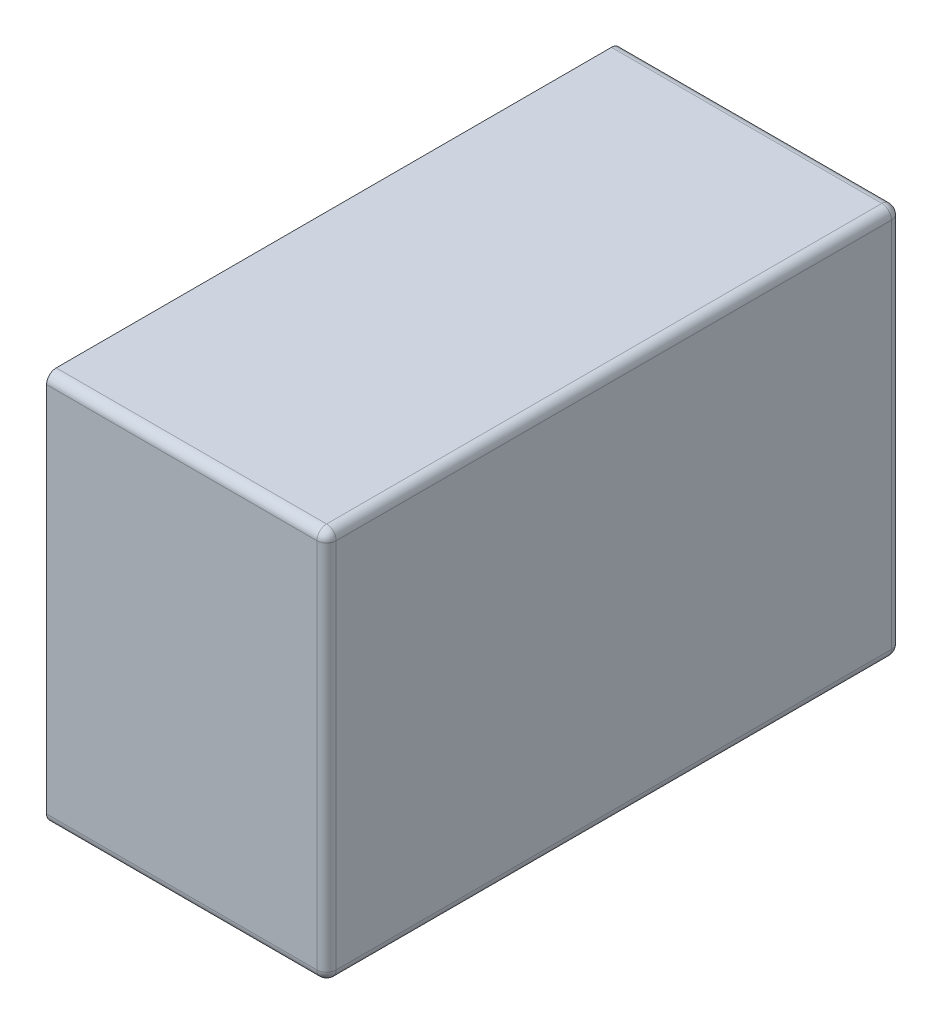
ISO-10303-21;
HEADER;
FILE_DESCRIPTION(('STEP AP214'),'2;1');
FILE_NAME('part.step','',(''),(''),'','','');
FILE_SCHEMA(('AUTOMOTIVE_DESIGN { 1 0 10303 214 1 1 1 1 }'));
ENDSEC;
DATA;
#1=APPLICATION_CONTEXT('core data for automotive mechanical design processes');
#2=APPLICATION_PROTOCOL_DEFINITION('international standard','automotive_design',2000,#1);
#3=PRODUCT_CONTEXT('',#1,'mechanical');
#4=PRODUCT('Part','Part','',(#3));
#5=PRODUCT_RELATED_PRODUCT_CATEGORY('part','',(#4));
#6=PRODUCT_DEFINITION_FORMATION('','',#4);
#7=PRODUCT_DEFINITION_CONTEXT('part definition',#1,'design');
#8=PRODUCT_DEFINITION('design','',#6,#7);
#9=PRODUCT_DEFINITION_SHAPE('','',#8);
#10=(LENGTH_UNIT() NAMED_UNIT(*) SI_UNIT(.MILLI.,.METRE.));
#11=(NAMED_UNIT(*) PLANE_ANGLE_UNIT() SI_UNIT($,.RADIAN.));
#12=(NAMED_UNIT(*) SI_UNIT($,.STERADIAN.) SOLID_ANGLE_UNIT());
#13=UNCERTAINTY_MEASURE_WITH_UNIT(LENGTH_MEASURE(1.E-05),#10,'distance_accuracy_value','');
#14=(GEOMETRIC_REPRESENTATION_CONTEXT(3) GLOBAL_UNCERTAINTY_ASSIGNED_CONTEXT((#13)) GLOBAL_UNIT_ASSIGNED_CONTEXT((#10,
#11,#12)) REPRESENTATION_CONTEXT('',''));
#15=CARTESIAN_POINT('',(0.,0.,0.));
#16=DIRECTION('',(0.,0.,1.));
#17=DIRECTION('',(1.,0.,0.));
#18=AXIS2_PLACEMENT_3D('',#15,#16,#17);
#19=CARTESIAN_POINT('',(145.,405.,-297.5));
#20=DIRECTION('',(-1.,0.,0.));
#21=DIRECTION('',(0.,0.,1.));
#22=AXIS2_PLACEMENT_3D('',#19,#20,#21);
#23=PLANE('',#22);
#24=DIRECTION('',(0.,-1.,0.));
#25=VECTOR('',#24,1.);
#26=CARTESIAN_POINT('',(145.,405.,287.5));
#27=LINE('',#26,#25);
#28=CARTESIAN_POINT('',(145.,395.,287.5));
#29=VERTEX_POINT('',#28);
#30=CARTESIAN_POINT('',(145.,10.,287.5));
#31=VERTEX_POINT('',#30);
#32=EDGE_CURVE('E192',#29,#31,#27,.T.);
#33=ORIENTED_EDGE('',*,*,#32,.T.);
#34=DIRECTION('',(0.,0.,-1.));
#35=VECTOR('',#34,1.);
#36=CARTESIAN_POINT('',(145.,10.,-297.5));
#37=LINE('',#36,#35);
#38=CARTESIAN_POINT('',(145.,10.,-287.5));
#39=VERTEX_POINT('',#38);
#40=EDGE_CURVE('E198',#31,#39,#37,.T.);
#41=ORIENTED_EDGE('',*,*,#40,.T.);
#42=DIRECTION('',(0.,-1.,0.));
#43=VECTOR('',#42,1.);
#44=CARTESIAN_POINT('',(145.,405.,-287.5));
#45=LINE('',#44,#43);
#46=CARTESIAN_POINT('',(145.,395.,-287.5));
#47=VERTEX_POINT('',#46);
#48=EDGE_CURVE('E196',#39,#47,#45,.F.);
#49=ORIENTED_EDGE('',*,*,#48,.T.);
#50=DIRECTION('',(0.,0.,-1.));
#51=VECTOR('',#50,1.);
#52=CARTESIAN_POINT('',(145.,395.,297.5));
#53=LINE('',#52,#51);
#54=EDGE_CURVE('E194',#47,#29,#53,.F.);
#55=ORIENTED_EDGE('',*,*,#54,.T.);
#56=EDGE_LOOP('',(#33,#41,#49,#55));
#57=FACE_BOUND('',#56,.T.);
#58=ADVANCED_FACE('F39',(#57),#23,.F.);
#59=CARTESIAN_POINT('',(-145.,405.,-297.5));
#60=DIRECTION('',(0.,0.,1.));
#61=DIRECTION('',(1.,0.,0.));
#62=AXIS2_PLACEMENT_3D('',#59,#60,#61);
#63=PLANE('',#62);
#64=DIRECTION('',(0.,-1.,0.));
#65=VECTOR('',#64,1.);
#66=CARTESIAN_POINT('',(135.,405.,-297.5));
#67=LINE('',#66,#65);
#68=CARTESIAN_POINT('',(135.,395.,-297.5));
#69=VERTEX_POINT('',#68);
#70=CARTESIAN_POINT('',(135.,10.,-297.5));
#71=VERTEX_POINT('',#70);
#72=EDGE_CURVE('E210',#69,#71,#67,.T.);
#73=ORIENTED_EDGE('',*,*,#72,.T.);
#74=DIRECTION('',(-1.,0.,0.));
#75=VECTOR('',#74,1.);
#76=CARTESIAN_POINT('',(-145.,10.,-297.5));
#77=LINE('',#76,#75);
#78=CARTESIAN_POINT('',(-145.,10.,-297.5));
#79=VERTEX_POINT('',#78);
#80=EDGE_CURVE('E212',#71,#79,#77,.T.);
#81=ORIENTED_EDGE('',*,*,#80,.T.);
#82=DIRECTION('',(0.,-1.,0.));
#83=VECTOR('',#82,1.);
#84=CARTESIAN_POINT('',(-145.,405.,-297.5));
#85=LINE('',#84,#83);
#86=CARTESIAN_POINT('',(-145.,395.,-297.5));
#87=VERTEX_POINT('',#86);
#88=EDGE_CURVE('E189',#87,#79,#85,.T.);
#89=ORIENTED_EDGE('',*,*,#88,.F.);
#90=DIRECTION('',(-1.,0.,0.));
#91=VECTOR('',#90,1.);
#92=CARTESIAN_POINT('',(145.,395.,-297.5));
#93=LINE('',#92,#91);
#94=EDGE_CURVE('E208',#87,#69,#93,.F.);
#95=ORIENTED_EDGE('',*,*,#94,.T.);
#96=EDGE_LOOP('',(#73,#81,#89,#95));
#97=FACE_BOUND('',#96,.T.);
#98=ADVANCED_FACE('F296',(#97),#63,.F.);
#99=CARTESIAN_POINT('',(-145.,405.,-297.5));
#100=DIRECTION('',(1.,0.,0.));
#101=DIRECTION('',(0.,0.,-1.));
#102=AXIS2_PLACEMENT_3D('',#99,#100,#101);
#103=PLANE('',#102);
#104=DIRECTION('',(0.,0.,-1.));
#105=VECTOR('',#104,1.);
#106=CARTESIAN_POINT('',(-145.,395.,-287.5));
#107=LINE('',#106,#105);
#108=CARTESIAN_POINT('',(-145.,395.,287.5));
#109=VERTEX_POINT('',#108);
#110=CARTESIAN_POINT('',(-145.,395.,-287.5));
#111=VERTEX_POINT('',#110);
#112=EDGE_CURVE('E170',#109,#111,#107,.T.);
#113=ORIENTED_EDGE('',*,*,#112,.F.);
#114=DIRECTION('',(0.,1.,0.));
#115=VECTOR('',#114,1.);
#116=CARTESIAN_POINT('',(-145.,395.,287.5));
#117=LINE('',#116,#115);
#118=CARTESIAN_POINT('',(-145.,10.,287.5));
#119=VERTEX_POINT('',#118);
#120=EDGE_CURVE('E56',#119,#109,#117,.T.);
#121=ORIENTED_EDGE('',*,*,#120,.F.);
#122=DIRECTION('',(0.,0.,1.));
#123=VECTOR('',#122,1.);
#124=CARTESIAN_POINT('',(-145.,10.,-287.5));
#125=LINE('',#124,#123);
#126=CARTESIAN_POINT('',(-145.,10.,-287.5));
#127=VERTEX_POINT('',#126);
#128=EDGE_CURVE('E161',#127,#119,#125,.T.);
#129=ORIENTED_EDGE('',*,*,#128,.F.);
#130=DIRECTION('',(0.,-1.,0.));
#131=VECTOR('',#130,1.);
#132=CARTESIAN_POINT('',(-145.,395.,-287.5));
#133=LINE('',#132,#131);
#134=EDGE_CURVE('E164',#111,#127,#133,.T.);
#135=ORIENTED_EDGE('',*,*,#134,.F.);
#136=EDGE_LOOP('',(#113,#121,#129,#135));
#137=FACE_BOUND('',#136,.T.);
#138=DIRECTION('',(0.,-1.,0.));
#139=VECTOR('',#138,1.);
#140=CARTESIAN_POINT('',(-145.,405.,297.5));
#141=LINE('',#140,#139);
#142=CARTESIAN_POINT('',(-145.,395.,297.5));
#143=VERTEX_POINT('',#142);
#144=CARTESIAN_POINT('',(-145.,10.,297.5));
#145=VERTEX_POINT('',#144);
#146=EDGE_CURVE('E183',#143,#145,#141,.T.);
#147=ORIENTED_EDGE('',*,*,#146,.F.);
#148=CARTESIAN_POINT('',(-145.,395.,287.5));
#149=DIRECTION('',(1.,0.,0.));
#150=DIRECTION('',(0.,0.,-1.));
#151=AXIS2_PLACEMENT_3D('',#148,#149,#150);
#152=CIRCLE('',#151,10.);
#153=CARTESIAN_POINT('',(-145.,405.,287.5));
#154=VERTEX_POINT('',#153);
#155=EDGE_CURVE('E11',#143,#154,#152,.F.);
#156=ORIENTED_EDGE('',*,*,#155,.T.);
#157=DIRECTION('',(0.,0.,1.));
#158=VECTOR('',#157,1.);
#159=CARTESIAN_POINT('',(-145.,405.,-297.5));
#160=LINE('',#159,#158);
#161=CARTESIAN_POINT('',(-145.,405.,-287.5));
#162=VERTEX_POINT('',#161);
#163=EDGE_CURVE('E180',#162,#154,#160,.T.);
#164=ORIENTED_EDGE('',*,*,#163,.F.);
#165=CARTESIAN_POINT('',(-145.,395.,-287.5));
#166=DIRECTION('',(1.,0.,0.));
#167=DIRECTION('',(0.,0.,-1.));
#168=AXIS2_PLACEMENT_3D('',#165,#166,#167);
#169=CIRCLE('',#168,10.);
#170=EDGE_CURVE('E225',#162,#87,#169,.F.);
#171=ORIENTED_EDGE('',*,*,#170,.T.);
#172=ORIENTED_EDGE('',*,*,#88,.T.);
#173=CARTESIAN_POINT('',(-145.,10.,-287.5));
#174=DIRECTION('',(1.,0.,0.));
#175=DIRECTION('',(0.,0.,-1.));
#176=AXIS2_PLACEMENT_3D('',#173,#174,#175);
#177=CIRCLE('',#176,10.);
#178=CARTESIAN_POINT('',(-145.,0.,-287.5));
#179=VERTEX_POINT('',#178);
#180=EDGE_CURVE('E227',#79,#179,#177,.F.);
#181=ORIENTED_EDGE('',*,*,#180,.T.);
#182=DIRECTION('',(0.,0.,1.));
#183=VECTOR('',#182,1.);
#184=CARTESIAN_POINT('',(-145.,0.,-297.5));
#185=LINE('',#184,#183);
#186=CARTESIAN_POINT('',(-145.,0.,287.5));
#187=VERTEX_POINT('',#186);
#188=EDGE_CURVE('E184',#179,#187,#185,.T.);
#189=ORIENTED_EDGE('',*,*,#188,.T.);
#190=CARTESIAN_POINT('',(-145.,10.,287.5));
#191=DIRECTION('',(1.,0.,0.));
#192=DIRECTION('',(0.,0.,-1.));
#193=AXIS2_PLACEMENT_3D('',#190,#191,#192);
#194=CIRCLE('',#193,10.);
#195=EDGE_CURVE('E48',#187,#145,#194,.F.);
#196=ORIENTED_EDGE('',*,*,#195,.T.);
#197=EDGE_LOOP('',(#147,#156,#164,#171,#172,#181,#189,#196));
#198=FACE_BOUND('',#197,.T.);
#199=ADVANCED_FACE('F293',(#137,#198),#103,.F.);
#200=CARTESIAN_POINT('',(-145.,405.,297.5));
#201=DIRECTION('',(0.,0.,-1.));
#202=DIRECTION('',(-1.,0.,0.));
#203=AXIS2_PLACEMENT_3D('',#200,#201,#202);
#204=PLANE('',#203);
#205=DIRECTION('',(0.,-1.,0.));
#206=VECTOR('',#205,1.);
#207=CARTESIAN_POINT('',(135.,405.,297.5));
#208=LINE('',#207,#206);
#209=CARTESIAN_POINT('',(135.,10.,297.5));
#210=VERTEX_POINT('',#209);
#211=CARTESIAN_POINT('',(135.,395.,297.5));
#212=VERTEX_POINT('',#211);
#213=EDGE_CURVE('E64',#210,#212,#208,.F.);
#214=ORIENTED_EDGE('',*,*,#213,.T.);
#215=DIRECTION('',(1.,0.,0.));
#216=VECTOR('',#215,1.);
#217=CARTESIAN_POINT('',(-145.,395.,297.5));
#218=LINE('',#217,#216);
#219=EDGE_CURVE('E223',#212,#143,#218,.F.);
#220=ORIENTED_EDGE('',*,*,#219,.T.);
#221=ORIENTED_EDGE('',*,*,#146,.T.);
#222=DIRECTION('',(1.,0.,0.));
#223=VECTOR('',#222,1.);
#224=CARTESIAN_POINT('',(-145.,10.,297.5));
#225=LINE('',#224,#223);
#226=EDGE_CURVE('E220',#145,#210,#225,.T.);
#227=ORIENTED_EDGE('',*,*,#226,.T.);
#228=EDGE_LOOP('',(#214,#220,#221,#227));
#229=FACE_BOUND('',#228,.T.);
#230=ADVANCED_FACE('F320',(#229),#204,.F.);
#231=CARTESIAN_POINT('',(0.,405.,0.));
#232=DIRECTION('',(0.,1.,0.));
#233=DIRECTION('',(0.,0.,1.));
#234=AXIS2_PLACEMENT_3D('',#231,#232,#233);
#235=PLANE('',#234);
#236=ORIENTED_EDGE('',*,*,#163,.T.);
#237=DIRECTION('',(1.,0.,0.));
#238=VECTOR('',#237,1.);
#239=CARTESIAN_POINT('',(145.,405.,287.5));
#240=LINE('',#239,#238);
#241=CARTESIAN_POINT('',(135.,405.,287.5));
#242=VERTEX_POINT('',#241);
#243=EDGE_CURVE('E218',#154,#242,#240,.T.);
#244=ORIENTED_EDGE('',*,*,#243,.T.);
#245=DIRECTION('',(0.,0.,-1.));
#246=VECTOR('',#245,1.);
#247=CARTESIAN_POINT('',(135.,405.,-297.5));
#248=LINE('',#247,#246);
#249=CARTESIAN_POINT('',(135.,405.,-287.5));
#250=VERTEX_POINT('',#249);
#251=EDGE_CURVE('E216',#242,#250,#248,.T.);
#252=ORIENTED_EDGE('',*,*,#251,.T.);
#253=DIRECTION('',(-1.,0.,0.));
#254=VECTOR('',#253,1.);
#255=CARTESIAN_POINT('',(-145.,405.,-287.5));
#256=LINE('',#255,#254);
#257=EDGE_CURVE('E214',#250,#162,#256,.T.);
#258=ORIENTED_EDGE('',*,*,#257,.T.);
#259=EDGE_LOOP('',(#236,#244,#252,#258));
#260=FACE_BOUND('',#259,.T.);
#261=ADVANCED_FACE('F282',(#260),#235,.T.);
#262=CARTESIAN_POINT('',(0.,0.,0.));
#263=DIRECTION('',(0.,1.,0.));
#264=DIRECTION('',(0.,0.,1.));
#265=AXIS2_PLACEMENT_3D('',#262,#263,#264);
#266=PLANE('',#265);
#267=DIRECTION('',(0.,0.,-1.));
#268=VECTOR('',#267,1.);
#269=CARTESIAN_POINT('',(135.,0.,0.));
#270=LINE('',#269,#268);
#271=CARTESIAN_POINT('',(135.,0.,-287.5));
#272=VERTEX_POINT('',#271);
#273=CARTESIAN_POINT('',(135.,0.,287.5));
#274=VERTEX_POINT('',#273);
#275=EDGE_CURVE('E203',#272,#274,#270,.F.);
#276=ORIENTED_EDGE('',*,*,#275,.T.);
#277=DIRECTION('',(1.,0.,0.));
#278=VECTOR('',#277,1.);
#279=CARTESIAN_POINT('',(0.,0.,287.5));
#280=LINE('',#279,#278);
#281=EDGE_CURVE('E206',#274,#187,#280,.F.);
#282=ORIENTED_EDGE('',*,*,#281,.T.);
#283=ORIENTED_EDGE('',*,*,#188,.F.);
#284=DIRECTION('',(-1.,0.,0.));
#285=VECTOR('',#284,1.);
#286=CARTESIAN_POINT('',(0.,0.,-287.5));
#287=LINE('',#286,#285);
#288=EDGE_CURVE('E201',#179,#272,#287,.F.);
#289=ORIENTED_EDGE('',*,*,#288,.T.);
#290=EDGE_LOOP('',(#276,#282,#283,#289));
#291=FACE_BOUND('',#290,.T.);
#292=ADVANCED_FACE('F313',(#291),#266,.F.);
#293=CARTESIAN_POINT('',(0.,395.,287.5));
#294=DIRECTION('',(-1.,0.,0.));
#295=DIRECTION('',(0.,0.,1.));
#296=AXIS2_PLACEMENT_3D('',#293,#294,#295);
#297=CYLINDRICAL_SURFACE('',#296,10.);
#298=ORIENTED_EDGE('',*,*,#155,.F.);
#299=ORIENTED_EDGE('',*,*,#219,.F.);
#300=CARTESIAN_POINT('',(135.,395.,287.5));
#301=DIRECTION('',(1.,0.,0.));
#302=DIRECTION('',(0.,0.,-1.));
#303=AXIS2_PLACEMENT_3D('',#300,#301,#302);
#304=CIRCLE('',#303,10.);
#305=EDGE_CURVE('E43',#242,#212,#304,.T.);
#306=ORIENTED_EDGE('',*,*,#305,.F.);
#307=ORIENTED_EDGE('',*,*,#243,.F.);
#308=EDGE_LOOP('',(#298,#299,#306,#307));
#309=FACE_BOUND('',#308,.T.);
#310=ADVANCED_FACE('F41',(#309),#297,.T.);
#311=CARTESIAN_POINT('',(135.,395.,0.));
#312=DIRECTION('',(0.,0.,1.));
#313=DIRECTION('',(1.,0.,0.));
#314=AXIS2_PLACEMENT_3D('',#311,#312,#313);
#315=CYLINDRICAL_SURFACE('',#314,10.);
#316=CARTESIAN_POINT('',(135.,395.,-287.5));
#317=DIRECTION('',(0.,0.,-1.));
#318=DIRECTION('',(-1.,0.,0.));
#319=AXIS2_PLACEMENT_3D('',#316,#317,#318);
#320=CIRCLE('',#319,10.);
#321=EDGE_CURVE('E254',#250,#47,#320,.T.);
#322=ORIENTED_EDGE('',*,*,#321,.F.);
#323=ORIENTED_EDGE('',*,*,#251,.F.);
#324=CARTESIAN_POINT('',(135.,395.,287.5));
#325=DIRECTION('',(0.,0.,1.));
#326=DIRECTION('',(1.,0.,0.));
#327=AXIS2_PLACEMENT_3D('',#324,#325,#326);
#328=CIRCLE('',#327,10.);
#329=EDGE_CURVE('E256',#29,#242,#328,.T.);
#330=ORIENTED_EDGE('',*,*,#329,.F.);
#331=ORIENTED_EDGE('',*,*,#54,.F.);
#332=EDGE_LOOP('',(#322,#323,#330,#331));
#333=FACE_BOUND('',#332,.T.);
#334=ADVANCED_FACE('F279',(#333),#315,.T.);
#335=CARTESIAN_POINT('',(0.,395.,-287.5));
#336=DIRECTION('',(1.,0.,0.));
#337=DIRECTION('',(0.,0.,-1.));
#338=AXIS2_PLACEMENT_3D('',#335,#336,#337);
#339=CYLINDRICAL_SURFACE('',#338,10.);
#340=ORIENTED_EDGE('',*,*,#170,.F.);
#341=ORIENTED_EDGE('',*,*,#257,.F.);
#342=CARTESIAN_POINT('',(135.,395.,-287.5));
#343=DIRECTION('',(1.,0.,0.));
#344=DIRECTION('',(0.,0.,-1.));
#345=AXIS2_PLACEMENT_3D('',#342,#343,#344);
#346=CIRCLE('',#345,10.);
#347=EDGE_CURVE('E251',#69,#250,#346,.T.);
#348=ORIENTED_EDGE('',*,*,#347,.F.);
#349=ORIENTED_EDGE('',*,*,#94,.F.);
#350=EDGE_LOOP('',(#340,#341,#348,#349));
#351=FACE_BOUND('',#350,.T.);
#352=ADVANCED_FACE('F287',(#351),#339,.T.);
#353=CARTESIAN_POINT('',(135.,395.,287.5));
#354=DIRECTION('',(0.,1.,0.));
#355=DIRECTION('',(0.,0.,1.));
#356=AXIS2_PLACEMENT_3D('',#353,#354,#355);
#357=SPHERICAL_SURFACE('',#356,10.);
#358=ORIENTED_EDGE('',*,*,#329,.T.);
#359=ORIENTED_EDGE('',*,*,#305,.T.);
#360=CARTESIAN_POINT('',(135.,395.,287.5));
#361=DIRECTION('',(0.,1.,0.));
#362=DIRECTION('',(0.,0.,1.));
#363=AXIS2_PLACEMENT_3D('',#360,#361,#362);
#364=CIRCLE('',#363,10.);
#365=EDGE_CURVE('E248',#29,#212,#364,.F.);
#366=ORIENTED_EDGE('',*,*,#365,.F.);
#367=EDGE_LOOP('',(#358,#359,#366));
#368=FACE_BOUND('',#367,.T.);
#369=ADVANCED_FACE('F263',(#368),#357,.T.);
#370=CARTESIAN_POINT('',(135.,395.,-287.5));
#371=DIRECTION('',(0.,1.,0.));
#372=DIRECTION('',(0.,0.,1.));
#373=AXIS2_PLACEMENT_3D('',#370,#371,#372);
#374=SPHERICAL_SURFACE('',#373,10.);
#375=ORIENTED_EDGE('',*,*,#347,.T.);
#376=ORIENTED_EDGE('',*,*,#321,.T.);
#377=CARTESIAN_POINT('',(135.,395.,-287.5));
#378=DIRECTION('',(0.,1.,0.));
#379=DIRECTION('',(0.,0.,1.));
#380=AXIS2_PLACEMENT_3D('',#377,#378,#379);
#381=CIRCLE('',#380,10.);
#382=EDGE_CURVE('E245',#69,#47,#381,.F.);
#383=ORIENTED_EDGE('',*,*,#382,.F.);
#384=EDGE_LOOP('',(#375,#376,#383));
#385=FACE_BOUND('',#384,.T.);
#386=ADVANCED_FACE('F352',(#385),#374,.T.);
#387=CARTESIAN_POINT('',(-145.,10.,287.5));
#388=DIRECTION('',(1.,0.,0.));
#389=DIRECTION('',(0.,0.,-1.));
#390=AXIS2_PLACEMENT_3D('',#387,#388,#389);
#391=CYLINDRICAL_SURFACE('',#390,10.);
#392=ORIENTED_EDGE('',*,*,#195,.F.);
#393=ORIENTED_EDGE('',*,*,#281,.F.);
#394=CARTESIAN_POINT('',(135.,10.,287.5));
#395=DIRECTION('',(1.,0.,0.));
#396=DIRECTION('',(0.,0.,-1.));
#397=AXIS2_PLACEMENT_3D('',#394,#395,#396);
#398=CIRCLE('',#397,10.);
#399=EDGE_CURVE('E242',#210,#274,#398,.T.);
#400=ORIENTED_EDGE('',*,*,#399,.F.);
#401=ORIENTED_EDGE('',*,*,#226,.F.);
#402=EDGE_LOOP('',(#392,#393,#400,#401));
#403=FACE_BOUND('',#402,.T.);
#404=ADVANCED_FACE('F319',(#403),#391,.T.);
#405=CARTESIAN_POINT('',(135.,405.,287.5));
#406=DIRECTION('',(0.,-1.,0.));
#407=DIRECTION('',(0.,0.,-1.));
#408=AXIS2_PLACEMENT_3D('',#405,#406,#407);
#409=CYLINDRICAL_SURFACE('',#408,10.);
#410=ORIENTED_EDGE('',*,*,#365,.T.);
#411=ORIENTED_EDGE('',*,*,#213,.F.);
#412=CARTESIAN_POINT('',(135.,10.,287.5));
#413=DIRECTION('',(0.,-1.,0.));
#414=DIRECTION('',(0.,0.,-1.));
#415=AXIS2_PLACEMENT_3D('',#412,#413,#414);
#416=CIRCLE('',#415,10.);
#417=EDGE_CURVE('E239',#31,#210,#416,.T.);
#418=ORIENTED_EDGE('',*,*,#417,.F.);
#419=ORIENTED_EDGE('',*,*,#32,.F.);
#420=EDGE_LOOP('',(#410,#411,#418,#419));
#421=FACE_BOUND('',#420,.T.);
#422=ADVANCED_FACE('F268',(#421),#409,.T.);
#423=CARTESIAN_POINT('',(135.,405.,-287.5));
#424=DIRECTION('',(0.,-1.,0.));
#425=DIRECTION('',(0.,0.,-1.));
#426=AXIS2_PLACEMENT_3D('',#423,#424,#425);
#427=CYLINDRICAL_SURFACE('',#426,10.);
#428=ORIENTED_EDGE('',*,*,#382,.T.);
#429=ORIENTED_EDGE('',*,*,#48,.F.);
#430=CARTESIAN_POINT('',(135.,10.,-287.5));
#431=DIRECTION('',(0.,-1.,0.));
#432=DIRECTION('',(0.,0.,-1.));
#433=AXIS2_PLACEMENT_3D('',#430,#431,#432);
#434=CIRCLE('',#433,10.);
#435=EDGE_CURVE('E236',#71,#39,#434,.T.);
#436=ORIENTED_EDGE('',*,*,#435,.F.);
#437=ORIENTED_EDGE('',*,*,#72,.F.);
#438=EDGE_LOOP('',(#428,#429,#436,#437));
#439=FACE_BOUND('',#438,.T.);
#440=ADVANCED_FACE('F306',(#439),#427,.T.);
#441=CARTESIAN_POINT('',(-145.,10.,-287.5));
#442=DIRECTION('',(-1.,0.,0.));
#443=DIRECTION('',(0.,0.,1.));
#444=AXIS2_PLACEMENT_3D('',#441,#442,#443);
#445=CYLINDRICAL_SURFACE('',#444,10.);
#446=ORIENTED_EDGE('',*,*,#180,.F.);
#447=ORIENTED_EDGE('',*,*,#80,.F.);
#448=CARTESIAN_POINT('',(135.,10.,-287.5));
#449=DIRECTION('',(1.,0.,0.));
#450=DIRECTION('',(0.,0.,-1.));
#451=AXIS2_PLACEMENT_3D('',#448,#449,#450);
#452=CIRCLE('',#451,10.);
#453=EDGE_CURVE('E233',#272,#71,#452,.T.);
#454=ORIENTED_EDGE('',*,*,#453,.F.);
#455=ORIENTED_EDGE('',*,*,#288,.F.);
#456=EDGE_LOOP('',(#446,#447,#454,#455));
#457=FACE_BOUND('',#456,.T.);
#458=ADVANCED_FACE('F302',(#457),#445,.T.);
#459=CARTESIAN_POINT('',(135.,10.,287.5));
#460=DIRECTION('',(0.,0.,1.));
#461=DIRECTION('',(0.,-1.,0.));
#462=AXIS2_PLACEMENT_3D('',#459,#460,#461);
#463=SPHERICAL_SURFACE('',#462,10.);
#464=ORIENTED_EDGE('',*,*,#417,.T.);
#465=ORIENTED_EDGE('',*,*,#399,.T.);
#466=CARTESIAN_POINT('',(135.,10.,287.5));
#467=DIRECTION('',(0.,0.,1.));
#468=DIRECTION('',(1.,0.,0.));
#469=AXIS2_PLACEMENT_3D('',#466,#467,#468);
#470=CIRCLE('',#469,10.);
#471=EDGE_CURVE('E231',#31,#274,#470,.F.);
#472=ORIENTED_EDGE('',*,*,#471,.F.);
#473=EDGE_LOOP('',(#464,#465,#472));
#474=FACE_BOUND('',#473,.T.);
#475=ADVANCED_FACE('F340',(#474),#463,.T.);
#476=CARTESIAN_POINT('',(135.,10.,-287.5));
#477=DIRECTION('',(0.,0.,-1.));
#478=DIRECTION('',(0.,1.,0.));
#479=AXIS2_PLACEMENT_3D('',#476,#477,#478);
#480=SPHERICAL_SURFACE('',#479,10.);
#481=ORIENTED_EDGE('',*,*,#453,.T.);
#482=ORIENTED_EDGE('',*,*,#435,.T.);
#483=CARTESIAN_POINT('',(135.,10.,-287.5));
#484=DIRECTION('',(0.,0.,-1.));
#485=DIRECTION('',(-1.,0.,0.));
#486=AXIS2_PLACEMENT_3D('',#483,#484,#485);
#487=CIRCLE('',#486,10.);
#488=EDGE_CURVE('E176',#272,#39,#487,.F.);
#489=ORIENTED_EDGE('',*,*,#488,.F.);
#490=EDGE_LOOP('',(#481,#482,#489));
#491=FACE_BOUND('',#490,.T.);
#492=ADVANCED_FACE('F309',(#491),#480,.T.);
#493=CARTESIAN_POINT('',(135.,10.,-297.5));
#494=DIRECTION('',(0.,0.,-1.));
#495=DIRECTION('',(-1.,0.,0.));
#496=AXIS2_PLACEMENT_3D('',#493,#494,#495);
#497=CYLINDRICAL_SURFACE('',#496,10.);
#498=ORIENTED_EDGE('',*,*,#471,.T.);
#499=ORIENTED_EDGE('',*,*,#275,.F.);
#500=ORIENTED_EDGE('',*,*,#488,.T.);
#501=ORIENTED_EDGE('',*,*,#40,.F.);
#502=EDGE_LOOP('',(#498,#499,#500,#501));
#503=FACE_BOUND('',#502,.T.);
#504=ADVANCED_FACE('F311',(#503),#497,.T.);
#505=CARTESIAN_POINT('',(125.,395.,287.5));
#506=DIRECTION('',(0.,0.,1.));
#507=DIRECTION('',(1.,0.,0.));
#508=AXIS2_PLACEMENT_3D('',#505,#506,#507);
#509=PLANE('',#508);
#510=ORIENTED_EDGE('',*,*,#120,.T.);
#511=DIRECTION('',(-1.,0.,0.));
#512=VECTOR('',#511,1.);
#513=CARTESIAN_POINT('',(125.,395.,287.5));
#514=LINE('',#513,#512);
#515=CARTESIAN_POINT('',(125.,395.,287.5));
#516=VERTEX_POINT('',#515);
#517=EDGE_CURVE('E139',#516,#109,#514,.T.);
#518=ORIENTED_EDGE('',*,*,#517,.F.);
#519=DIRECTION('',(0.,1.,0.));
#520=VECTOR('',#519,1.);
#521=CARTESIAN_POINT('',(125.,395.,287.5));
#522=LINE('',#521,#520);
#523=CARTESIAN_POINT('',(125.,10.,287.5));
#524=VERTEX_POINT('',#523);
#525=EDGE_CURVE('E143',#524,#516,#522,.T.);
#526=ORIENTED_EDGE('',*,*,#525,.F.);
#527=DIRECTION('',(-1.,0.,0.));
#528=VECTOR('',#527,1.);
#529=CARTESIAN_POINT('',(125.,10.,287.5));
#530=LINE('',#529,#528);
#531=EDGE_CURVE('E174',#524,#119,#530,.T.);
#532=ORIENTED_EDGE('',*,*,#531,.T.);
#533=EDGE_LOOP('',(#510,#518,#526,#532));
#534=FACE_BOUND('',#533,.T.);
#535=ADVANCED_FACE('F141',(#534),#509,.F.);
#536=CARTESIAN_POINT('',(125.,10.,-287.5));
#537=DIRECTION('',(0.,-1.,0.));
#538=DIRECTION('',(0.,0.,-1.));
#539=AXIS2_PLACEMENT_3D('',#536,#537,#538);
#540=PLANE('',#539);
#541=ORIENTED_EDGE('',*,*,#128,.T.);
#542=ORIENTED_EDGE('',*,*,#531,.F.);
#543=DIRECTION('',(0.,0.,1.));
#544=VECTOR('',#543,1.);
#545=CARTESIAN_POINT('',(125.,10.,-287.5));
#546=LINE('',#545,#544);
#547=CARTESIAN_POINT('',(125.,10.,-287.5));
#548=VERTEX_POINT('',#547);
#549=EDGE_CURVE('E149',#548,#524,#546,.T.);
#550=ORIENTED_EDGE('',*,*,#549,.F.);
#551=DIRECTION('',(-1.,0.,0.));
#552=VECTOR('',#551,1.);
#553=CARTESIAN_POINT('',(125.,10.,-287.5));
#554=LINE('',#553,#552);
#555=EDGE_CURVE('E177',#548,#127,#554,.T.);
#556=ORIENTED_EDGE('',*,*,#555,.T.);
#557=EDGE_LOOP('',(#541,#542,#550,#556));
#558=FACE_BOUND('',#557,.T.);
#559=ADVANCED_FACE('F406',(#558),#540,.F.);
#560=CARTESIAN_POINT('',(125.,395.,-287.5));
#561=DIRECTION('',(0.,0.,-1.));
#562=DIRECTION('',(0.,1.,0.));
#563=AXIS2_PLACEMENT_3D('',#560,#561,#562);
#564=PLANE('',#563);
#565=ORIENTED_EDGE('',*,*,#134,.T.);
#566=ORIENTED_EDGE('',*,*,#555,.F.);
#567=DIRECTION('',(0.,-1.,0.));
#568=VECTOR('',#567,1.);
#569=CARTESIAN_POINT('',(125.,395.,-287.5));
#570=LINE('',#569,#568);
#571=CARTESIAN_POINT('',(125.,395.,-287.5));
#572=VERTEX_POINT('',#571);
#573=EDGE_CURVE('E157',#572,#548,#570,.T.);
#574=ORIENTED_EDGE('',*,*,#573,.F.);
#575=DIRECTION('',(-1.,0.,0.));
#576=VECTOR('',#575,1.);
#577=CARTESIAN_POINT('',(125.,395.,-287.5));
#578=LINE('',#577,#576);
#579=EDGE_CURVE('E148',#572,#111,#578,.T.);
#580=ORIENTED_EDGE('',*,*,#579,.T.);
#581=EDGE_LOOP('',(#565,#566,#574,#580));
#582=FACE_BOUND('',#581,.T.);
#583=ADVANCED_FACE('F413',(#582),#564,.F.);
#584=CARTESIAN_POINT('',(125.,395.,-287.5));
#585=DIRECTION('',(0.,1.,0.));
#586=DIRECTION('',(0.,0.,1.));
#587=AXIS2_PLACEMENT_3D('',#584,#585,#586);
#588=PLANE('',#587);
#589=ORIENTED_EDGE('',*,*,#112,.T.);
#590=ORIENTED_EDGE('',*,*,#579,.F.);
#591=DIRECTION('',(0.,0.,-1.));
#592=VECTOR('',#591,1.);
#593=CARTESIAN_POINT('',(125.,395.,-287.5));
#594=LINE('',#593,#592);
#595=EDGE_CURVE('E152',#516,#572,#594,.T.);
#596=ORIENTED_EDGE('',*,*,#595,.F.);
#597=ORIENTED_EDGE('',*,*,#517,.T.);
#598=EDGE_LOOP('',(#589,#590,#596,#597));
#599=FACE_BOUND('',#598,.T.);
#600=ADVANCED_FACE('F153',(#599),#588,.F.);
#601=CARTESIAN_POINT('',(125.,0.,0.));
#602=DIRECTION('',(-1.,0.,0.));
#603=DIRECTION('',(0.,0.,1.));
#604=AXIS2_PLACEMENT_3D('',#601,#602,#603);
#605=PLANE('',#604);
#606=ORIENTED_EDGE('',*,*,#525,.T.);
#607=ORIENTED_EDGE('',*,*,#595,.T.);
#608=ORIENTED_EDGE('',*,*,#573,.T.);
#609=ORIENTED_EDGE('',*,*,#549,.T.);
#610=EDGE_LOOP('',(#606,#607,#608,#609));
#611=FACE_BOUND('',#610,.T.);
#612=ADVANCED_FACE('F159',(#611),#605,.T.);
#613=CLOSED_SHELL('',(#58,#98,#199,#230,#261,#292,#310,#334,#352,#369,#386,#404,#422,#440,#458,
#475,#492,#504,#535,#559,#583,#600,#612));
#614=MANIFOLD_SOLID_BREP('B2',#613);
#615=ADVANCED_BREP_SHAPE_REPRESENTATION('',(#18,#614),#14);
#616=SHAPE_DEFINITION_REPRESENTATION(#9,#615);
ENDSEC;
END-ISO-10303-21;
